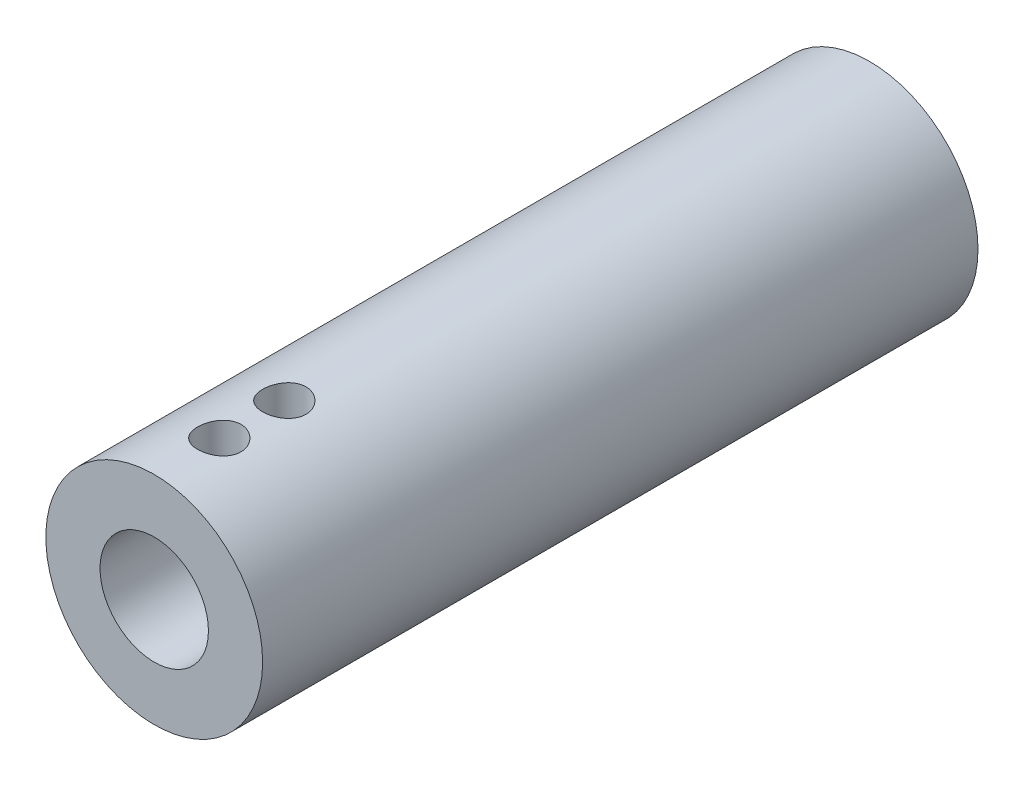
ISO-10303-21;
HEADER;
FILE_DESCRIPTION(('STEP AP214'),'2;1');
FILE_NAME('part.step','',(''),(''),'','','');
FILE_SCHEMA(('AUTOMOTIVE_DESIGN { 1 0 10303 214 1 1 1 1 }'));
ENDSEC;
DATA;
#1=APPLICATION_CONTEXT('core data for automotive mechanical design processes');
#2=APPLICATION_PROTOCOL_DEFINITION('international standard','automotive_design',2000,#1);
#3=PRODUCT_CONTEXT('',#1,'mechanical');
#4=PRODUCT('Part','Part','',(#3));
#5=PRODUCT_RELATED_PRODUCT_CATEGORY('part','',(#4));
#6=PRODUCT_DEFINITION_FORMATION('','',#4);
#7=PRODUCT_DEFINITION_CONTEXT('part definition',#1,'design');
#8=PRODUCT_DEFINITION('design','',#6,#7);
#9=PRODUCT_DEFINITION_SHAPE('','',#8);
#10=(LENGTH_UNIT() NAMED_UNIT(*) SI_UNIT(.MILLI.,.METRE.));
#11=(NAMED_UNIT(*) PLANE_ANGLE_UNIT() SI_UNIT($,.RADIAN.));
#12=(NAMED_UNIT(*) SI_UNIT($,.STERADIAN.) SOLID_ANGLE_UNIT());
#13=UNCERTAINTY_MEASURE_WITH_UNIT(LENGTH_MEASURE(1.E-05),#10,'distance_accuracy_value','');
#14=(GEOMETRIC_REPRESENTATION_CONTEXT(3) GLOBAL_UNCERTAINTY_ASSIGNED_CONTEXT((#13)) GLOBAL_UNIT_ASSIGNED_CONTEXT((#10,
#11,#12)) REPRESENTATION_CONTEXT('',''));
#15=CARTESIAN_POINT('',(0.,0.,0.));
#16=DIRECTION('',(0.,0.,1.));
#17=DIRECTION('',(1.,0.,0.));
#18=AXIS2_PLACEMENT_3D('',#15,#16,#17);
#19=CARTESIAN_POINT('',(0.,0.,33.));
#20=DIRECTION('',(0.,0.,-1.));
#21=DIRECTION('',(-1.,0.,0.));
#22=AXIS2_PLACEMENT_3D('',#19,#20,#21);
#23=CYLINDRICAL_SURFACE('',#22,5.);
#24=CARTESIAN_POINT('',(0.,0.,33.));
#25=DIRECTION('',(0.,0.,1.));
#26=DIRECTION('',(1.,0.,0.));
#27=AXIS2_PLACEMENT_3D('',#24,#25,#26);
#28=CIRCLE('',#27,5.);
#29=CARTESIAN_POINT('',(5.,0.,33.));
#30=VERTEX_POINT('',#29);
#31=EDGE_CURVE('E10',#30,#30,#28,.T.);
#32=ORIENTED_EDGE('',*,*,#31,.F.);
#33=EDGE_LOOP('',(#32));
#34=FACE_BOUND('',#33,.T.);
#35=CARTESIAN_POINT('',(0.,0.,0.));
#36=DIRECTION('',(0.,0.,1.));
#37=DIRECTION('',(1.,0.,0.));
#38=AXIS2_PLACEMENT_3D('',#35,#36,#37);
#39=CIRCLE('',#38,5.);
#40=CARTESIAN_POINT('',(5.,0.,0.));
#41=VERTEX_POINT('',#40);
#42=EDGE_CURVE('E48',#41,#41,#39,.T.);
#43=ORIENTED_EDGE('',*,*,#42,.T.);
#44=EDGE_LOOP('',(#43));
#45=FACE_BOUND('',#44,.T.);
#46=CARTESIAN_POINT('',(0.,5.,26.));
#47=CARTESIAN_POINT('',(-0.0555769067926259,4.99999897580871,26.0000020444983));
#48=CARTESIAN_POINT('',(-0.111179660201515,4.99906385178231,26.0046488429676));
#49=CARTESIAN_POINT('',(-0.220813507689012,4.99542365623231,26.0230985001152));
#50=CARTESIAN_POINT('',(-0.274843317541349,4.99271717860186,26.0369086328015));
#51=CARTESIAN_POINT('',(-0.379730305263306,4.98583649278287,26.0732412736208));
#52=CARTESIAN_POINT('',(-0.430590467933128,4.98166369076718,26.0957554368447));
#53=CARTESIAN_POINT('',(-0.527807988864219,4.97230398035314,26.1488322475113));
#54=CARTESIAN_POINT('',(-0.574165615075805,4.96711713235707,26.1793944156072));
#55=CARTESIAN_POINT('',(-0.661693477314859,4.9562216532997,26.2481384942914));
#56=CARTESIAN_POINT('',(-0.702793951158519,4.95050745504347,26.2864083553912));
#57=CARTESIAN_POINT('',(-0.778036756608022,4.93924180452588,26.3692924163917));
#58=CARTESIAN_POINT('',(-0.812178544770418,4.93369036500424,26.4139071113351));
#59=CARTESIAN_POINT('',(-0.872831753347614,4.92332441812615,26.5087161930119));
#60=CARTESIAN_POINT('',(-0.899270938865861,4.91851707364946,26.5589576437964));
#61=CARTESIAN_POINT('',(-0.943305666580302,4.91026268058418,26.6632818190041));
#62=CARTESIAN_POINT('',(-0.960902082437231,4.90681549761962,26.7173641633463));
#63=CARTESIAN_POINT('',(-0.98652529988482,4.90172805252205,26.8270843639079));
#64=CARTESIAN_POINT('',(-0.99467449795877,4.90006470107188,26.8826925441422));
#65=CARTESIAN_POINT('',(-1.00155212772611,4.89866375060627,26.9945098213643));
#66=CARTESIAN_POINT('',(-1.00028152271349,4.89892595467841,27.0507188563202));
#67=CARTESIAN_POINT('',(-0.988454573101811,4.90132551148185,27.161246788021));
#68=CARTESIAN_POINT('',(-0.978038540243898,4.90343452858764,27.2155814056273));
#69=CARTESIAN_POINT('',(-0.948437884623044,4.90924546160001,27.321716076663));
#70=CARTESIAN_POINT('',(-0.929252843100675,4.91294745357779,27.373516008919));
#71=CARTESIAN_POINT('',(-0.882524783674714,4.92155618500408,27.4735152617036));
#72=CARTESIAN_POINT('',(-0.854926151232108,4.92647089813705,27.5216878795692));
#73=CARTESIAN_POINT('',(-0.792193574572671,4.93694618773062,27.6127708499728));
#74=CARTESIAN_POINT('',(-0.75705876435682,4.94250683838366,27.6556805968512));
#75=CARTESIAN_POINT('',(-0.679499934560575,4.95377021241462,27.7358294024569));
#76=CARTESIAN_POINT('',(-0.636956161212436,4.95947369210905,27.7729525678591));
#77=CARTESIAN_POINT('',(-0.546185024062001,4.97028848714409,27.8395538463012));
#78=CARTESIAN_POINT('',(-0.497957587379379,4.97539979488974,27.8690318612936));
#79=CARTESIAN_POINT('',(-0.397059386878911,4.98446690160887,27.919527509226));
#80=CARTESIAN_POINT('',(-0.34438181958529,4.98842088848272,27.9405318936445));
#81=CARTESIAN_POINT('',(-0.236148976448656,4.99471408987858,27.9733604740386));
#82=CARTESIAN_POINT('',(-0.180594050072441,4.99705350000531,27.9851857820736));
#83=CARTESIAN_POINT('',(-0.0691794056271419,4.99982671866868,27.9991564537943));
#84=CARTESIAN_POINT('',(-0.0133403283255677,5.0002917465247,28.0014604195403));
#85=CARTESIAN_POINT('',(0.0979249341927224,4.99935051930103,27.9967501410578));
#86=CARTESIAN_POINT('',(0.153351142443801,4.99794436941446,27.9897364206474));
#87=CARTESIAN_POINT('',(0.261705659946549,4.99343832008018,27.966721626456));
#88=CARTESIAN_POINT('',(0.314651948339911,4.99035376404206,27.9508019315021));
#89=CARTESIAN_POINT('',(0.417123627499674,4.98283552061033,27.9105160173442));
#90=CARTESIAN_POINT('',(0.466648761637547,4.97840173214227,27.8861491653232));
#91=CARTESIAN_POINT('',(0.561541173686224,4.96859911533294,27.8293175093487));
#92=CARTESIAN_POINT('',(0.606850126752194,4.96321950437052,27.7967572189611));
#93=CARTESIAN_POINT('',(0.691418019119213,4.95214734829882,27.7245908087927));
#94=CARTESIAN_POINT('',(0.730676308930769,4.94645476968388,27.6849839336001));
#95=CARTESIAN_POINT('',(0.802640590774184,4.93529303556965,27.5991266481089));
#96=CARTESIAN_POINT('',(0.835237702448663,4.92982860233304,27.5527842557787));
#97=CARTESIAN_POINT('',(0.892185420051214,4.91984191796194,27.4551886386433));
#98=CARTESIAN_POINT('',(0.916536355922911,4.91531962913342,27.4039356104265));
#99=CARTESIAN_POINT('',(0.956151841581969,4.90776740584383,27.2982317538505));
#100=CARTESIAN_POINT('',(0.971463499791059,4.90472974872186,27.2437991587897));
#101=CARTESIAN_POINT('',(0.992708651627204,4.90047436792025,27.1330665465091));
#102=CARTESIAN_POINT('',(0.998643368225121,4.89925640691111,27.0767667737907));
#103=CARTESIAN_POINT('',(1.00092091086748,4.89879149631379,26.9649911354557));
#104=CARTESIAN_POINT('',(0.997435788070903,4.89950919189301,26.909518851073));
#105=CARTESIAN_POINT('',(0.981352304100067,4.90275573484614,26.799968350095));
#106=CARTESIAN_POINT('',(0.968754016129305,4.90528456767169,26.7458901223052));
#107=CARTESIAN_POINT('',(0.934878568498961,4.91185264219158,26.6407722887595));
#108=CARTESIAN_POINT('',(0.91362250671735,4.9158882101883,26.5897256394976));
#109=CARTESIAN_POINT('',(0.863054644601609,4.9250171497417,26.4918962792656));
#110=CARTESIAN_POINT('',(0.833742168774888,4.93011060998894,26.4451139262749));
#111=CARTESIAN_POINT('',(0.767305914786421,4.94088960523225,26.3562844278497));
#112=CARTESIAN_POINT('',(0.730057887235187,4.94658372909699,26.3143312347324));
#113=CARTESIAN_POINT('',(0.649064369013148,4.95786081871955,26.2372137944708));
#114=CARTESIAN_POINT('',(0.605317387153343,4.96344375863184,26.2020511096827));
#115=CARTESIAN_POINT('',(0.512017629088256,4.97393832387971,26.1391653560536));
#116=CARTESIAN_POINT('',(0.462408884429844,4.97884231219246,26.11152399672));
#117=CARTESIAN_POINT('',(0.35916636094074,4.98735125085,26.0650138774034));
#118=CARTESIAN_POINT('',(0.305536260863133,4.99095737138616,26.0461372104675));
#119=CARTESIAN_POINT('',(0.209821488923786,4.99576372595371,26.0213480519553));
#120=CARTESIAN_POINT('',(0.168281664013792,4.99734303158452,26.0133568062922));
#121=CARTESIAN_POINT('',(0.0844995252100748,4.99946154139893,26.0026820876416));
#122=CARTESIAN_POINT('',(0.0422572337486266,5.00000077873155,25.9999984454902));
#123=CARTESIAN_POINT('',(0.,5.,26.));
#124=B_SPLINE_CURVE_WITH_KNOTS('',3,(#46,#47,#48,#49,#50,#51,#52,#53,#54,#55,#56,#57,#58,#59,
#60,#61,#62,#63,#64,#65,#66,#67,#68,#69,#70,#71,#72,#73,#74,#75,#76,#77,#78,#79,#80,#81,#82,#83,
#84,#85,#86,#87,#88,#89,#90,#91,#92,#93,#94,#95,#96,#97,#98,#99,#100,#101,#102,#103,#104,#105,
#106,#107,#108,#109,#110,#111,#112,#113,#114,#115,#116,#117,#118,#119,#120,#121,#122,#123),
.UNSPECIFIED.,.T.,.F.,(4,2,2,2,2,2,2,2,2,2,2,2,2,2,2,2,2,2,2,2,2,2,2,2,2,2,2,2,2,2,2,2,2,2,2,2,
2,2,4),(0.,0.166576130661259,0.333284650691323,0.499833735250342,0.666372902230865,
0.834932670112188,1.00350559674737,1.17361195005923,1.34370149365198,1.51156185103587,
1.67940504281225,1.84471727006278,2.0100373925373,2.17647490203592,2.34293154749671,
2.51238252491351,2.68183567539821,2.85155274854024,3.02124925698036,3.18810735676265,
3.35495607657868,3.52030453950724,3.68566539216022,3.85305066033359,4.0204538834593,
4.19040628579226,4.36035188723467,4.52940381032724,4.69843368330415,4.86439722567702,
5.03035943492609,5.19591961253111,5.36149367581867,5.52988076239143,5.6983065453293,
5.86849496675637,6.03852955517519,6.16518775289894,6.29184191370996),.UNSPECIFIED.);
#125=CARTESIAN_POINT('',(0.,5.,26.));
#126=VERTEX_POINT('',#125);
#127=EDGE_CURVE('E64',#126,#126,#124,.T.);
#128=ORIENTED_EDGE('',*,*,#127,.F.);
#129=EDGE_LOOP('',(#128));
#130=FACE_BOUND('',#129,.T.);
#131=CARTESIAN_POINT('',(0.,5.,29.));
#132=CARTESIAN_POINT('',(-0.0555769067926252,4.99999897580871,29.0000020444983));
#133=CARTESIAN_POINT('',(-0.111179660201514,4.99906385178231,29.0046488429676));
#134=CARTESIAN_POINT('',(-0.220813507689011,4.99542365623231,29.0230985001152));
#135=CARTESIAN_POINT('',(-0.274843317541348,4.99271717860186,29.0369086328015));
#136=CARTESIAN_POINT('',(-0.379730305263306,4.98583649278287,29.0732412736208));
#137=CARTESIAN_POINT('',(-0.430590467933127,4.98166369076718,29.0957554368447));
#138=CARTESIAN_POINT('',(-0.527807988864219,4.97230398035314,29.1488322475113));
#139=CARTESIAN_POINT('',(-0.574165615075805,4.96711713235707,29.1793944156072));
#140=CARTESIAN_POINT('',(-0.661693477314858,4.9562216532997,29.2481384942914));
#141=CARTESIAN_POINT('',(-0.702793951158518,4.95050745504347,29.2864083553912));
#142=CARTESIAN_POINT('',(-0.778036756608021,4.93924180452588,29.3692924163917));
#143=CARTESIAN_POINT('',(-0.812178544770417,4.93369036500424,29.4139071113351));
#144=CARTESIAN_POINT('',(-0.872831753347613,4.92332441812615,29.5087161930119));
#145=CARTESIAN_POINT('',(-0.899270938865859,4.91851707364946,29.5589576437964));
#146=CARTESIAN_POINT('',(-0.9433056665803,4.91026268058418,29.6632818190041));
#147=CARTESIAN_POINT('',(-0.96090208243723,4.90681549761962,29.7173641633463));
#148=CARTESIAN_POINT('',(-0.98652529988482,4.90172805252205,29.8270843639079));
#149=CARTESIAN_POINT('',(-0.99467449795877,4.90006470107188,29.8826925441422));
#150=CARTESIAN_POINT('',(-1.00155212772611,4.89866375060627,29.9945098213643));
#151=CARTESIAN_POINT('',(-1.00028152271349,4.89892595467841,30.0507188563202));
#152=CARTESIAN_POINT('',(-0.988454573101811,4.90132551148185,30.161246788021));
#153=CARTESIAN_POINT('',(-0.978038540243898,4.90343452858764,30.2155814056273));
#154=CARTESIAN_POINT('',(-0.948437884623043,4.90924546160001,30.321716076663));
#155=CARTESIAN_POINT('',(-0.929252843100674,4.91294745357779,30.373516008919));
#156=CARTESIAN_POINT('',(-0.882524783674713,4.92155618500408,30.4735152617036));
#157=CARTESIAN_POINT('',(-0.854926151232109,4.92647089813704,30.5216878795692));
#158=CARTESIAN_POINT('',(-0.792193574572672,4.93694618773062,30.6127708499728));
#159=CARTESIAN_POINT('',(-0.75705876435682,4.94250683838366,30.6556805968512));
#160=CARTESIAN_POINT('',(-0.679499934560574,4.95377021241462,30.7358294024569));
#161=CARTESIAN_POINT('',(-0.636956161212434,4.95947369210905,30.7729525678591));
#162=CARTESIAN_POINT('',(-0.546185024062,4.97028848714409,30.8395538463012));
#163=CARTESIAN_POINT('',(-0.497957587379378,4.97539979488974,30.8690318612936));
#164=CARTESIAN_POINT('',(-0.39705938687891,4.98446690160887,30.919527509226));
#165=CARTESIAN_POINT('',(-0.34438181958529,4.98842088848272,30.9405318936445));
#166=CARTESIAN_POINT('',(-0.236148976448656,4.99471408987858,30.9733604740386));
#167=CARTESIAN_POINT('',(-0.18059405007244,4.99705350000531,30.9851857820736));
#168=CARTESIAN_POINT('',(-0.0691794056271416,4.99982671866868,30.9991564537943));
#169=CARTESIAN_POINT('',(-0.0133403283255674,5.0002917465247,31.0014604195403));
#170=CARTESIAN_POINT('',(0.0979249341927227,4.99935051930103,30.9967501410578));
#171=CARTESIAN_POINT('',(0.153351142443802,4.99794436941446,30.9897364206474));
#172=CARTESIAN_POINT('',(0.261705659946549,4.99343832008018,30.966721626456));
#173=CARTESIAN_POINT('',(0.314651948339911,4.99035376404206,30.9508019315021));
#174=CARTESIAN_POINT('',(0.417123627499675,4.98283552061033,30.9105160173442));
#175=CARTESIAN_POINT('',(0.466648761637547,4.97840173214227,30.8861491653232));
#176=CARTESIAN_POINT('',(0.561541173686225,4.96859911533294,30.8293175093487));
#177=CARTESIAN_POINT('',(0.606850126752196,4.96321950437052,30.7967572189611));
#178=CARTESIAN_POINT('',(0.691418019119215,4.95214734829882,30.7245908087927));
#179=CARTESIAN_POINT('',(0.73067630893077,4.94645476968388,30.6849839336001));
#180=CARTESIAN_POINT('',(0.802640590774185,4.93529303556965,30.5991266481089));
#181=CARTESIAN_POINT('',(0.835237702448665,4.92982860233304,30.5527842557787));
#182=CARTESIAN_POINT('',(0.892185420051215,4.91984191796194,30.4551886386433));
#183=CARTESIAN_POINT('',(0.916536355922912,4.91531962913342,30.4039356104264));
#184=CARTESIAN_POINT('',(0.956151841581969,4.90776740584383,30.2982317538504));
#185=CARTESIAN_POINT('',(0.971463499791059,4.90472974872186,30.2437991587897));
#186=CARTESIAN_POINT('',(0.992708651627205,4.90047436792025,30.1330665465091));
#187=CARTESIAN_POINT('',(0.998643368225121,4.89925640691111,30.0767667737907));
#188=CARTESIAN_POINT('',(1.00092091086748,4.89879149631379,29.9649911354557));
#189=CARTESIAN_POINT('',(0.997435788070904,4.89950919189301,29.909518851073));
#190=CARTESIAN_POINT('',(0.981352304100069,4.90275573484614,29.799968350095));
#191=CARTESIAN_POINT('',(0.968754016129306,4.90528456767169,29.7458901223052));
#192=CARTESIAN_POINT('',(0.934878568498961,4.91185264219158,29.6407722887595));
#193=CARTESIAN_POINT('',(0.913622506717351,4.9158882101883,29.5897256394976));
#194=CARTESIAN_POINT('',(0.863054644601611,4.9250171497417,29.4918962792656));
#195=CARTESIAN_POINT('',(0.833742168774889,4.93011060998894,29.4451139262749));
#196=CARTESIAN_POINT('',(0.767305914786421,4.94088960523225,29.3562844278497));
#197=CARTESIAN_POINT('',(0.730057887235186,4.94658372909699,29.3143312347324));
#198=CARTESIAN_POINT('',(0.649064369013147,4.95786081871955,29.2372137944708));
#199=CARTESIAN_POINT('',(0.605317387153343,4.96344375863184,29.2020511096827));
#200=CARTESIAN_POINT('',(0.512017629088256,4.97393832387971,29.1391653560536));
#201=CARTESIAN_POINT('',(0.462408884429844,4.97884231219246,29.11152399672));
#202=CARTESIAN_POINT('',(0.359166360940741,4.98735125085,29.0650138774034));
#203=CARTESIAN_POINT('',(0.305536260863134,4.99095737138616,29.0461372104675));
#204=CARTESIAN_POINT('',(0.209821488923786,4.99576372595371,29.0213480519553));
#205=CARTESIAN_POINT('',(0.168281664013792,4.99734303158452,29.0133568062922));
#206=CARTESIAN_POINT('',(0.0844995252100748,4.99946154139893,29.0026820876416));
#207=CARTESIAN_POINT('',(0.0422572337486269,5.00000077873155,28.9999984454902));
#208=CARTESIAN_POINT('',(0.,5.,29.));
#209=B_SPLINE_CURVE_WITH_KNOTS('',3,(#131,#132,#133,#134,#135,#136,#137,#138,#139,#140,#141,
#142,#143,#144,#145,#146,#147,#148,#149,#150,#151,#152,#153,#154,#155,#156,#157,#158,#159,#160,
#161,#162,#163,#164,#165,#166,#167,#168,#169,#170,#171,#172,#173,#174,#175,#176,#177,#178,#179,
#180,#181,#182,#183,#184,#185,#186,#187,#188,#189,#190,#191,#192,#193,#194,#195,#196,#197,#198,
#199,#200,#201,#202,#203,#204,#205,#206,#207,#208),.UNSPECIFIED.,.T.,.F.,(4,2,2,2,2,2,2,2,2,2,2,
2,2,2,2,2,2,2,2,2,2,2,2,2,2,2,2,2,2,2,2,2,2,2,2,2,2,2,4),(0.,0.166576130661258,
0.333284650691324,0.499833735250343,0.666372902230865,0.834932670112189,1.00350559674737,
1.17361195005923,1.34370149365198,1.51156185103587,1.67940504281225,1.84471727006278,
2.0100373925373,2.17647490203592,2.34293154749671,2.51238252491351,2.68183567539821,
2.85155274854024,3.02124925698036,3.18810735676265,3.35495607657868,3.52030453950724,
3.68566539216023,3.85305066033359,4.0204538834593,4.19040628579226,4.36035188723467,
4.52940381032724,4.69843368330415,4.86439722567702,5.03035943492609,5.1959196125311,
5.36149367581867,5.52988076239144,5.69830654532931,5.86849496675637,6.03852955517519,
6.16518775289895,6.29184191370997),.UNSPECIFIED.);
#210=CARTESIAN_POINT('',(0.,5.,29.));
#211=VERTEX_POINT('',#210);
#212=EDGE_CURVE('E85',#211,#211,#209,.T.);
#213=ORIENTED_EDGE('',*,*,#212,.F.);
#214=EDGE_LOOP('',(#213));
#215=FACE_BOUND('',#214,.T.);
#216=ADVANCED_FACE('F35',(#34,#45,#130,#215),#23,.T.);
#217=CARTESIAN_POINT('',(0.,0.,18.));
#218=DIRECTION('',(0.,0.,1.));
#219=DIRECTION('',(1.,0.,0.));
#220=AXIS2_PLACEMENT_3D('',#217,#218,#219);
#221=CYLINDRICAL_SURFACE('',#220,2.5);
#222=CARTESIAN_POINT('',(0.,0.,18.));
#223=DIRECTION('',(0.,0.,1.));
#224=DIRECTION('',(1.,0.,0.));
#225=AXIS2_PLACEMENT_3D('',#222,#223,#224);
#226=CIRCLE('',#225,2.5);
#227=CARTESIAN_POINT('',(2.5,0.,18.));
#228=VERTEX_POINT('',#227);
#229=EDGE_CURVE('E53',#228,#228,#226,.T.);
#230=ORIENTED_EDGE('',*,*,#229,.F.);
#231=EDGE_LOOP('',(#230));
#232=FACE_BOUND('',#231,.T.);
#233=CARTESIAN_POINT('',(0.,0.,33.));
#234=DIRECTION('',(0.,0.,1.));
#235=DIRECTION('',(1.,0.,0.));
#236=AXIS2_PLACEMENT_3D('',#233,#234,#235);
#237=CIRCLE('',#236,2.5);
#238=CARTESIAN_POINT('',(2.5,0.,33.));
#239=VERTEX_POINT('',#238);
#240=EDGE_CURVE('E56',#239,#239,#237,.T.);
#241=ORIENTED_EDGE('',*,*,#240,.T.);
#242=EDGE_LOOP('',(#241));
#243=FACE_BOUND('',#242,.T.);
#244=CARTESIAN_POINT('',(0.,2.5,26.));
#245=CARTESIAN_POINT('',(0.053746502721453,2.49999635613542,26.0000049259119));
#246=CARTESIAN_POINT('',(0.107586282045344,2.49824647153466,26.0043588760442));
#247=CARTESIAN_POINT('',(0.213748240208955,2.49141726550321,26.0216238517606));
#248=CARTESIAN_POINT('',(0.266065888780632,2.48632889349439,26.0345581395431));
#249=CARTESIAN_POINT('',(0.367476961363709,2.47337104606559,26.0684380390294));
#250=CARTESIAN_POINT('',(0.416580330808487,2.46551068182036,26.0893574231084));
#251=CARTESIAN_POINT('',(0.510535985164191,2.44778305398039,26.1385095866633));
#252=CARTESIAN_POINT('',(0.555389738375503,2.43791648729028,26.1667398274595));
#253=CARTESIAN_POINT('',(0.641750503785203,2.41665443085209,26.2311177492805));
#254=CARTESIAN_POINT('',(0.683031136275114,2.40521148464595,26.2675533281201));
#255=CARTESIAN_POINT('',(0.759087502392369,2.38230288453097,26.3467000017384));
#256=CARTESIAN_POINT('',(0.793860053566774,2.37083722226896,26.3894141486059));
#257=CARTESIAN_POINT('',(0.857437283646447,2.34861395898568,26.4822140351211));
#258=CARTESIAN_POINT('',(0.885907490597744,2.33791057982475,26.5325432430116));
#259=CARTESIAN_POINT('',(0.933877359518582,2.31916823593396,26.63776819921));
#260=CARTESIAN_POINT('',(0.953381282142925,2.31112800622088,26.6926617639242));
#261=CARTESIAN_POINT('',(0.981949411697941,2.29913178830409,26.8028561667961));
#262=CARTESIAN_POINT('',(0.991446982902831,2.29500710177802,26.8580256177881));
#263=CARTESIAN_POINT('',(1.00108648082002,2.29082002024572,26.9693174991536));
#264=CARTESIAN_POINT('',(1.00123300815662,2.29075562761384,27.0254394473125));
#265=CARTESIAN_POINT('',(0.99249468375228,2.29455250139997,27.132878335729));
#266=CARTESIAN_POINT('',(0.984237657152576,2.29814087519225,27.1842578572045));
#267=CARTESIAN_POINT('',(0.959973440148917,2.30838093803918,27.2848297780034));
#268=CARTESIAN_POINT('',(0.943964897402323,2.31503316160836,27.3340217940552));
#269=CARTESIAN_POINT('',(0.904347366275544,2.33079742544265,27.430008918098));
#270=CARTESIAN_POINT('',(0.880589931157665,2.33995689640394,27.4767346195274));
#271=CARTESIAN_POINT('',(0.826253230366113,2.35969058194945,27.5657079081808));
#272=CARTESIAN_POINT('',(0.795671402550429,2.37026532728424,27.6079538047014));
#273=CARTESIAN_POINT('',(0.725775299727224,2.39263368371135,27.690204864401));
#274=CARTESIAN_POINT('',(0.685968731485323,2.40445832488076,27.729784364723));
#275=CARTESIAN_POINT('',(0.600157213715101,2.42729912479141,27.801842239001));
#276=CARTESIAN_POINT('',(0.554151032667223,2.43831512222662,27.8343191987052));
#277=CARTESIAN_POINT('',(0.456038826302928,2.45857340632274,27.8918087237079));
#278=CARTESIAN_POINT('',(0.403830245673245,2.46777635047707,27.9166611405985));
#279=CARTESIAN_POINT('',(0.295511882741447,2.48307414164379,27.957083930539));
#280=CARTESIAN_POINT('',(0.239404098424844,2.48917056731191,27.9726590187787));
#281=CARTESIAN_POINT('',(0.128447943803917,2.49728069753455,27.9932241477099));
#282=CARTESIAN_POINT('',(0.0737216469927748,2.49951472916757,27.9987862271268));
#283=CARTESIAN_POINT('',(-0.0359226549039006,2.50034239255315,28.0008565502643));
#284=CARTESIAN_POINT('',(-0.0908406066119537,2.49893696791146,27.9973671407738));
#285=CARTESIAN_POINT('',(-0.196716369560986,2.49278783531877,27.981854123724));
#286=CARTESIAN_POINT('',(-0.247741245887729,2.48819695672762,27.9702210098245));
#287=CARTESIAN_POINT('',(-0.347067714030382,2.4762972070275,27.9392821458451));
#288=CARTESIAN_POINT('',(-0.395368955112415,2.46898798678265,27.9199754101657));
#289=CARTESIAN_POINT('',(-0.489539392908343,2.45208297385406,27.87360753016));
#290=CARTESIAN_POINT('',(-0.535289011377695,2.44242407989902,27.8463272639784));
#291=CARTESIAN_POINT('',(-0.621721795623269,2.42186682372763,27.7850298380472));
#292=CARTESIAN_POINT('',(-0.662402920380554,2.41096796555135,27.7510099785387));
#293=CARTESIAN_POINT('',(-0.740361521514402,2.38822558819056,27.6745649935252));
#294=CARTESIAN_POINT('',(-0.777236966903025,2.37636720712526,27.6317332292469));
#295=CARTESIAN_POINT('',(-0.843375598706848,2.35370836458566,27.5402799584953));
#296=CARTESIAN_POINT('',(-0.872637530668747,2.34290807763256,27.49165749983));
#297=CARTESIAN_POINT('',(-0.922903750965805,2.32357149953855,27.389269152703));
#298=CARTESIAN_POINT('',(-0.943825297267218,2.31505815442394,27.3354580003939));
#299=CARTESIAN_POINT('',(-0.976148109852644,2.30161836738966,27.2246331741424));
#300=CARTESIAN_POINT('',(-0.98755640263465,2.29668927847999,27.1676218970938));
#301=CARTESIAN_POINT('',(-0.999857808639194,2.29135879649963,27.0564360491127));
#302=CARTESIAN_POINT('',(-1.00144854115143,2.29065710504086,27.0023525802033));
#303=CARTESIAN_POINT('',(-0.995901579638755,2.29307418016549,26.8947275711434));
#304=CARTESIAN_POINT('',(-0.988764993956884,2.29619246162397,26.8411859630487));
#305=CARTESIAN_POINT('',(-0.966535683076817,2.30563324539511,26.7383339050725));
#306=CARTESIAN_POINT('',(-0.951768746785482,2.31182415913725,26.6889398627835));
#307=CARTESIAN_POINT('',(-0.915002724245499,2.32662000616349,26.5933106851933));
#308=CARTESIAN_POINT('',(-0.893001640696899,2.33522560603004,26.5470764265501));
#309=CARTESIAN_POINT('',(-0.840936381379857,2.35449304802246,26.4561951903646));
#310=CARTESIAN_POINT('',(-0.810482667579738,2.36524441156621,26.4117906649348));
#311=CARTESIAN_POINT('',(-0.742946059635741,2.38731902186119,26.3285033413981));
#312=CARTESIAN_POINT('',(-0.705861167409054,2.39864244024203,26.2896222139358));
#313=CARTESIAN_POINT('',(-0.623252753136224,2.42146783543697,26.2158985733682));
#314=CARTESIAN_POINT('',(-0.577338000573062,2.43293378981093,26.181481346551));
#315=CARTESIAN_POINT('',(-0.479950160142882,2.45400203356859,26.1208314786892));
#316=CARTESIAN_POINT('',(-0.428474502273611,2.46360345546453,26.0946026439237));
#317=CARTESIAN_POINT('',(-0.322369031247594,2.47969857407931,26.0516888924049));
#318=CARTESIAN_POINT('',(-0.267815809109841,2.48624681527514,26.0348353382198));
#319=CARTESIAN_POINT('',(-0.156438273140603,2.49572153104683,26.0106804395229));
#320=CARTESIAN_POINT('',(-0.0996217629294482,2.49865949747819,26.0033487816281));
#321=CARTESIAN_POINT('',(-0.0284561489454569,2.49987949752068,26.0003023095109));
#322=CARTESIAN_POINT('',(-0.0142313443703716,2.50000096484588,25.9999986956854));
#323=CARTESIAN_POINT('',(0.,2.5,26.));
#324=B_SPLINE_CURVE_WITH_KNOTS('',3,(#244,#245,#246,#247,#248,#249,#250,#251,#252,#253,#254,
#255,#256,#257,#258,#259,#260,#261,#262,#263,#264,#265,#266,#267,#268,#269,#270,#271,#272,#273,
#274,#275,#276,#277,#278,#279,#280,#281,#282,#283,#284,#285,#286,#287,#288,#289,#290,#291,#292,
#293,#294,#295,#296,#297,#298,#299,#300,#301,#302,#303,#304,#305,#306,#307,#308,#309,#310,#311,
#312,#313,#314,#315,#316,#317,#318,#319,#320,#321,#322,#323),.UNSPECIFIED.,.T.,.F.,(4,2,2,2,2,2,
2,2,2,2,2,2,2,2,2,2,2,2,2,2,2,2,2,2,2,2,2,2,2,2,2,2,2,2,2,2,2,2,2,4),(0.,0.161201493946536,
0.322841818003967,0.48395572873579,0.645013767839922,0.812986908501986,0.981041974672059,
1.15657629409609,1.33202711559134,1.49952052654414,1.66693153170244,1.82269164200686,
1.97847893628024,2.13744563149409,2.29647210969092,2.46779174593279,2.63914546419867,
2.81388456581404,2.98853478056895,3.15284592264004,3.31711446785041,3.47400227782183,
3.63091024496898,3.79261756699131,3.95438979749485,4.12684237312207,4.29932334521874,
4.47347522570414,4.64749836322967,4.80899836696374,4.97047786281523,5.12557159274385,
5.28070817902581,5.44472734028346,5.60879600674197,5.78350211766918,5.95828931820267,
6.1298215050666,6.30080626202171,6.34349022948398),.UNSPECIFIED.);
#325=CARTESIAN_POINT('',(0.,2.5,26.));
#326=VERTEX_POINT('',#325);
#327=EDGE_CURVE('E58',#326,#326,#324,.T.);
#328=ORIENTED_EDGE('',*,*,#327,.F.);
#329=EDGE_LOOP('',(#328));
#330=FACE_BOUND('',#329,.T.);
#331=CARTESIAN_POINT('',(0.,2.5,29.));
#332=CARTESIAN_POINT('',(0.0537465027214532,2.49999635613542,29.0000049259119));
#333=CARTESIAN_POINT('',(0.107586282045344,2.49824647153466,29.0043588760442));
#334=CARTESIAN_POINT('',(0.213748240208955,2.49141726550321,29.0216238517606));
#335=CARTESIAN_POINT('',(0.266065888780632,2.48632889349439,29.0345581395431));
#336=CARTESIAN_POINT('',(0.367476961363709,2.47337104606559,29.0684380390294));
#337=CARTESIAN_POINT('',(0.416580330808486,2.46551068182036,29.0893574231084));
#338=CARTESIAN_POINT('',(0.51053598516419,2.44778305398039,29.1385095866633));
#339=CARTESIAN_POINT('',(0.555389738375503,2.43791648729028,29.1667398274595));
#340=CARTESIAN_POINT('',(0.641750503785204,2.41665443085209,29.2311177492805));
#341=CARTESIAN_POINT('',(0.683031136275116,2.40521148464595,29.2675533281201));
#342=CARTESIAN_POINT('',(0.759087502392371,2.38230288453097,29.3467000017384));
#343=CARTESIAN_POINT('',(0.793860053566775,2.37083722226896,29.3894141486059));
#344=CARTESIAN_POINT('',(0.857437283646447,2.34861395898568,29.4822140351211));
#345=CARTESIAN_POINT('',(0.885907490597744,2.33791057982475,29.5325432430116));
#346=CARTESIAN_POINT('',(0.933877359518582,2.31916823593396,29.63776819921));
#347=CARTESIAN_POINT('',(0.953381282142925,2.31112800622088,29.6926617639242));
#348=CARTESIAN_POINT('',(0.981949411697942,2.29913178830409,29.8028561667961));
#349=CARTESIAN_POINT('',(0.991446982902832,2.29500710177802,29.8580256177881));
#350=CARTESIAN_POINT('',(1.00108648082002,2.29082002024572,29.9693174991536));
#351=CARTESIAN_POINT('',(1.00123300815662,2.29075562761384,30.0254394473125));
#352=CARTESIAN_POINT('',(0.99249468375228,2.29455250139997,30.132878335729));
#353=CARTESIAN_POINT('',(0.984237657152576,2.29814087519225,30.1842578572045));
#354=CARTESIAN_POINT('',(0.959973440148918,2.30838093803918,30.2848297780034));
#355=CARTESIAN_POINT('',(0.943964897402324,2.31503316160836,30.3340217940552));
#356=CARTESIAN_POINT('',(0.904347366275544,2.33079742544265,30.430008918098));
#357=CARTESIAN_POINT('',(0.880589931157666,2.33995689640394,30.4767346195273));
#358=CARTESIAN_POINT('',(0.826253230366114,2.35969058194945,30.5657079081808));
#359=CARTESIAN_POINT('',(0.79567140255043,2.37026532728424,30.6079538047014));
#360=CARTESIAN_POINT('',(0.725775299727224,2.39263368371135,30.690204864401));
#361=CARTESIAN_POINT('',(0.685968731485323,2.40445832488076,30.729784364723));
#362=CARTESIAN_POINT('',(0.600157213715102,2.42729912479141,30.801842239001));
#363=CARTESIAN_POINT('',(0.554151032667224,2.43831512222662,30.8343191987052));
#364=CARTESIAN_POINT('',(0.456038826302929,2.45857340632274,30.8918087237079));
#365=CARTESIAN_POINT('',(0.403830245673246,2.46777635047707,30.9166611405985));
#366=CARTESIAN_POINT('',(0.295511882741448,2.48307414164379,30.957083930539));
#367=CARTESIAN_POINT('',(0.239404098424844,2.48917056731191,30.9726590187787));
#368=CARTESIAN_POINT('',(0.128447943803918,2.49728069753455,30.9932241477099));
#369=CARTESIAN_POINT('',(0.0737216469927753,2.49951472916757,30.9987862271268));
#370=CARTESIAN_POINT('',(-0.0359226549039003,2.50034239255315,31.0008565502643));
#371=CARTESIAN_POINT('',(-0.0908406066119534,2.49893696791146,30.9973671407738));
#372=CARTESIAN_POINT('',(-0.196716369560985,2.49278783531877,30.981854123724));
#373=CARTESIAN_POINT('',(-0.247741245887728,2.48819695672762,30.9702210098245));
#374=CARTESIAN_POINT('',(-0.347067714030382,2.4762972070275,30.9392821458451));
#375=CARTESIAN_POINT('',(-0.395368955112414,2.46898798678265,30.9199754101657));
#376=CARTESIAN_POINT('',(-0.489539392908342,2.45208297385406,30.87360753016));
#377=CARTESIAN_POINT('',(-0.535289011377693,2.44242407989902,30.8463272639784));
#378=CARTESIAN_POINT('',(-0.621721795623268,2.42186682372763,30.7850298380472));
#379=CARTESIAN_POINT('',(-0.662402920380553,2.41096796555135,30.7510099785387));
#380=CARTESIAN_POINT('',(-0.7403615215144,2.38822558819056,30.6745649935252));
#381=CARTESIAN_POINT('',(-0.777236966903023,2.37636720712526,30.6317332292469));
#382=CARTESIAN_POINT('',(-0.843375598706847,2.35370836458566,30.5402799584953));
#383=CARTESIAN_POINT('',(-0.872637530668746,2.34290807763256,30.49165749983));
#384=CARTESIAN_POINT('',(-0.922903750965806,2.32357149953855,30.3892691527029));
#385=CARTESIAN_POINT('',(-0.943825297267219,2.31505815442394,30.3354580003938));
#386=CARTESIAN_POINT('',(-0.976148109852645,2.30161836738966,30.2246331741424));
#387=CARTESIAN_POINT('',(-0.98755640263465,2.29668927847999,30.1676218970938));
#388=CARTESIAN_POINT('',(-0.999857808639194,2.29135879649963,30.0564360491127));
#389=CARTESIAN_POINT('',(-1.00144854115143,2.29065710504086,30.0023525802033));
#390=CARTESIAN_POINT('',(-0.995901579638754,2.29307418016549,29.8947275711434));
#391=CARTESIAN_POINT('',(-0.988764993956883,2.29619246162397,29.8411859630487));
#392=CARTESIAN_POINT('',(-0.966535683076816,2.30563324539511,29.7383339050725));
#393=CARTESIAN_POINT('',(-0.95176874678548,2.31182415913725,29.6889398627835));
#394=CARTESIAN_POINT('',(-0.915002724245498,2.32662000616349,29.5933106851933));
#395=CARTESIAN_POINT('',(-0.893001640696898,2.33522560603004,29.5470764265501));
#396=CARTESIAN_POINT('',(-0.840936381379856,2.35449304802246,29.4561951903646));
#397=CARTESIAN_POINT('',(-0.810482667579736,2.36524441156621,29.4117906649348));
#398=CARTESIAN_POINT('',(-0.742946059635739,2.38731902186119,29.3285033413981));
#399=CARTESIAN_POINT('',(-0.705861167409053,2.39864244024203,29.2896222139358));
#400=CARTESIAN_POINT('',(-0.623252753136224,2.42146783543697,29.2158985733682));
#401=CARTESIAN_POINT('',(-0.577338000573061,2.43293378981093,29.181481346551));
#402=CARTESIAN_POINT('',(-0.479950160142881,2.45400203356859,29.1208314786892));
#403=CARTESIAN_POINT('',(-0.42847450227361,2.46360345546453,29.0946026439237));
#404=CARTESIAN_POINT('',(-0.322369031247594,2.47969857407931,29.0516888924049));
#405=CARTESIAN_POINT('',(-0.26781580910984,2.48624681527514,29.0348353382198));
#406=CARTESIAN_POINT('',(-0.156438273140602,2.49572153104683,29.0106804395229));
#407=CARTESIAN_POINT('',(-0.0996217629294478,2.49865949747819,29.0033487816281));
#408=CARTESIAN_POINT('',(-0.0284561489454564,2.49987949752068,29.0003023095109));
#409=CARTESIAN_POINT('',(-0.014231344370371,2.50000096484588,28.9999986956854));
#410=CARTESIAN_POINT('',(0.,2.5,29.));
#411=B_SPLINE_CURVE_WITH_KNOTS('',3,(#331,#332,#333,#334,#335,#336,#337,#338,#339,#340,#341,
#342,#343,#344,#345,#346,#347,#348,#349,#350,#351,#352,#353,#354,#355,#356,#357,#358,#359,#360,
#361,#362,#363,#364,#365,#366,#367,#368,#369,#370,#371,#372,#373,#374,#375,#376,#377,#378,#379,
#380,#381,#382,#383,#384,#385,#386,#387,#388,#389,#390,#391,#392,#393,#394,#395,#396,#397,#398,
#399,#400,#401,#402,#403,#404,#405,#406,#407,#408,#409,#410),.UNSPECIFIED.,.T.,.F.,(4,2,2,2,2,2,
2,2,2,2,2,2,2,2,2,2,2,2,2,2,2,2,2,2,2,2,2,2,2,2,2,2,2,2,2,2,2,2,2,4),(0.,0.161201493946535,
0.322841818003967,0.483955728735789,0.645013767839922,0.812986908501987,0.981041974672059,
1.15657629409608,1.33202711559134,1.49952052654414,1.66693153170244,1.82269164200686,
1.97847893628024,2.13744563149408,2.29647210969092,2.46779174593279,2.63914546419867,
2.81388456581403,2.98853478056895,3.15284592264004,3.31711446785041,3.47400227782183,
3.63091024496898,3.79261756699131,3.95438979749484,4.12684237312207,4.29932334521874,
4.47347522570414,4.64749836322967,4.80899836696374,4.97047786281523,5.12557159274385,
5.28070817902581,5.44472734028346,5.60879600674197,5.78350211766918,5.95828931820267,
6.1298215050666,6.30080626202171,6.34349022948398),.UNSPECIFIED.);
#412=CARTESIAN_POINT('',(0.,2.5,29.));
#413=VERTEX_POINT('',#412);
#414=EDGE_CURVE('E39',#413,#413,#411,.T.);
#415=ORIENTED_EDGE('',*,*,#414,.F.);
#416=EDGE_LOOP('',(#415));
#417=FACE_BOUND('',#416,.T.);
#418=ADVANCED_FACE('F65',(#232,#243,#330,#417),#221,.F.);
#419=CARTESIAN_POINT('',(0.,0.,33.));
#420=DIRECTION('',(0.,0.,1.));
#421=DIRECTION('',(1.,0.,0.));
#422=AXIS2_PLACEMENT_3D('',#419,#420,#421);
#423=PLANE('',#422);
#424=ORIENTED_EDGE('',*,*,#240,.F.);
#425=EDGE_LOOP('',(#424));
#426=FACE_BOUND('',#425,.T.);
#427=ORIENTED_EDGE('',*,*,#31,.T.);
#428=EDGE_LOOP('',(#427));
#429=FACE_BOUND('',#428,.T.);
#430=ADVANCED_FACE('F104',(#426,#429),#423,.T.);
#431=CARTESIAN_POINT('',(0.,0.,0.));
#432=DIRECTION('',(0.,0.,1.));
#433=DIRECTION('',(1.,0.,0.));
#434=AXIS2_PLACEMENT_3D('',#431,#432,#433);
#435=PLANE('',#434);
#436=CARTESIAN_POINT('',(0.,0.,0.));
#437=DIRECTION('',(0.,0.,-1.));
#438=DIRECTION('',(-1.,0.,0.));
#439=AXIS2_PLACEMENT_3D('',#436,#437,#438);
#440=CIRCLE('',#439,1.5);
#441=CARTESIAN_POINT('',(-1.5,0.,0.));
#442=VERTEX_POINT('',#441);
#443=EDGE_CURVE('E91',#442,#442,#440,.T.);
#444=ORIENTED_EDGE('',*,*,#443,.F.);
#445=EDGE_LOOP('',(#444));
#446=FACE_BOUND('',#445,.T.);
#447=ORIENTED_EDGE('',*,*,#42,.F.);
#448=EDGE_LOOP('',(#447));
#449=FACE_BOUND('',#448,.T.);
#450=ADVANCED_FACE('F106',(#446,#449),#435,.F.);
#451=CARTESIAN_POINT('',(0.,0.,18.));
#452=DIRECTION('',(0.,0.,1.));
#453=DIRECTION('',(1.,0.,0.));
#454=AXIS2_PLACEMENT_3D('',#451,#452,#453);
#455=PLANE('',#454);
#456=ORIENTED_EDGE('',*,*,#229,.T.);
#457=EDGE_LOOP('',(#456));
#458=FACE_BOUND('',#457,.T.);
#459=ADVANCED_FACE('F111',(#458),#455,.T.);
#460=CARTESIAN_POINT('',(0.,0.,10.));
#461=DIRECTION('',(0.,0.,-1.));
#462=DIRECTION('',(-1.,0.,0.));
#463=AXIS2_PLACEMENT_3D('',#460,#461,#462);
#464=CYLINDRICAL_SURFACE('',#463,1.5);
#465=CARTESIAN_POINT('',(0.,0.,10.));
#466=DIRECTION('',(0.,0.,-1.));
#467=DIRECTION('',(-1.,0.,0.));
#468=AXIS2_PLACEMENT_3D('',#465,#466,#467);
#469=CIRCLE('',#468,1.5);
#470=CARTESIAN_POINT('',(-1.5,0.,10.));
#471=VERTEX_POINT('',#470);
#472=EDGE_CURVE('E92',#471,#471,#469,.T.);
#473=ORIENTED_EDGE('',*,*,#472,.F.);
#474=EDGE_LOOP('',(#473));
#475=FACE_BOUND('',#474,.T.);
#476=ORIENTED_EDGE('',*,*,#443,.T.);
#477=EDGE_LOOP('',(#476));
#478=FACE_BOUND('',#477,.T.);
#479=ADVANCED_FACE('F142',(#475,#478),#464,.F.);
#480=CARTESIAN_POINT('',(0.,0.,10.));
#481=DIRECTION('',(0.,0.,-1.));
#482=DIRECTION('',(-1.,0.,0.));
#483=AXIS2_PLACEMENT_3D('',#480,#481,#482);
#484=PLANE('',#483);
#485=ORIENTED_EDGE('',*,*,#472,.T.);
#486=EDGE_LOOP('',(#485));
#487=FACE_BOUND('',#486,.T.);
#488=ADVANCED_FACE('F74',(#487),#484,.T.);
#489=CARTESIAN_POINT('',(0.,10.,27.));
#490=DIRECTION('',(0.,-1.,0.));
#491=DIRECTION('',(0.,0.,-1.));
#492=AXIS2_PLACEMENT_3D('',#489,#490,#491);
#493=CYLINDRICAL_SURFACE('',#492,1.);
#494=ORIENTED_EDGE('',*,*,#327,.T.);
#495=EDGE_LOOP('',(#494));
#496=FACE_BOUND('',#495,.T.);
#497=ORIENTED_EDGE('',*,*,#127,.T.);
#498=EDGE_LOOP('',(#497));
#499=FACE_BOUND('',#498,.T.);
#500=ADVANCED_FACE('F69',(#496,#499),#493,.F.);
#501=CARTESIAN_POINT('',(0.,10.,30.));
#502=DIRECTION('',(0.,-1.,0.));
#503=DIRECTION('',(0.,0.,-1.));
#504=AXIS2_PLACEMENT_3D('',#501,#502,#503);
#505=CYLINDRICAL_SURFACE('',#504,1.);
#506=ORIENTED_EDGE('',*,*,#414,.T.);
#507=EDGE_LOOP('',(#506));
#508=FACE_BOUND('',#507,.T.);
#509=ORIENTED_EDGE('',*,*,#212,.T.);
#510=EDGE_LOOP('',(#509));
#511=FACE_BOUND('',#510,.T.);
#512=ADVANCED_FACE('F73',(#508,#511),#505,.F.);
#513=CLOSED_SHELL('',(#216,#418,#430,#450,#459,#479,#488,#500,#512));
#514=MANIFOLD_SOLID_BREP('B2',#513);
#515=ADVANCED_BREP_SHAPE_REPRESENTATION('',(#18,#514),#14);
#516=SHAPE_DEFINITION_REPRESENTATION(#9,#515);
ENDSEC;
END-ISO-10303-21;
